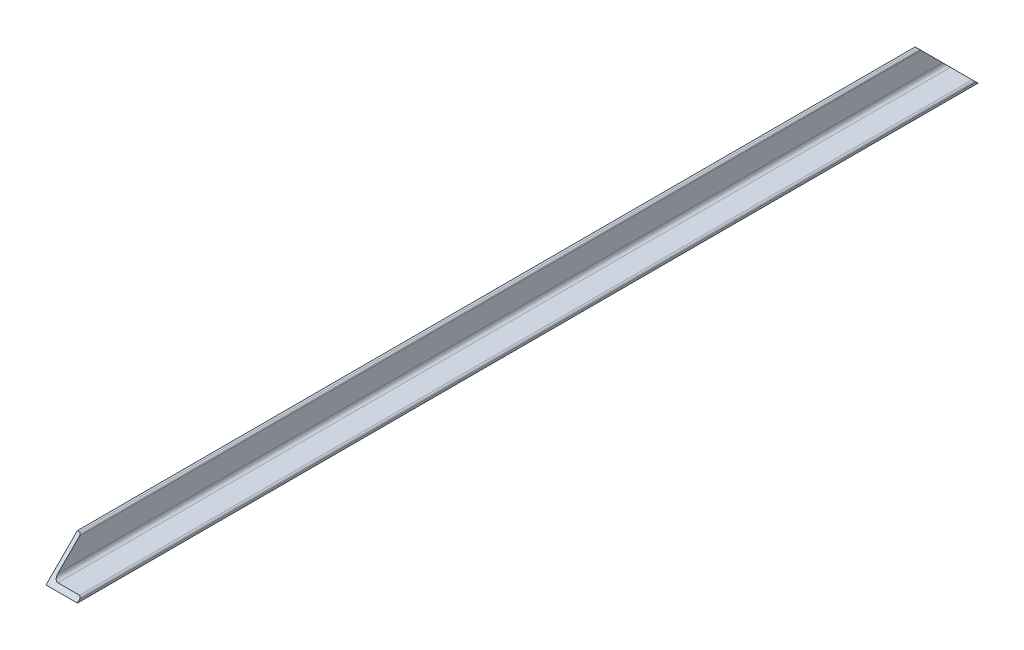
ISO-10303-21;
HEADER;
FILE_DESCRIPTION(('STEP AP214'),'2;1');
FILE_NAME('part.step','',(''),(''),'','','');
FILE_SCHEMA(('AUTOMOTIVE_DESIGN { 1 0 10303 214 1 1 1 1 }'));
ENDSEC;
DATA;
#1=APPLICATION_CONTEXT('core data for automotive mechanical design processes');
#2=APPLICATION_PROTOCOL_DEFINITION('international standard','automotive_design',2000,#1);
#3=PRODUCT_CONTEXT('',#1,'mechanical');
#4=PRODUCT('Part','Part','',(#3));
#5=PRODUCT_RELATED_PRODUCT_CATEGORY('part','',(#4));
#6=PRODUCT_DEFINITION_FORMATION('','',#4);
#7=PRODUCT_DEFINITION_CONTEXT('part definition',#1,'design');
#8=PRODUCT_DEFINITION('design','',#6,#7);
#9=PRODUCT_DEFINITION_SHAPE('','',#8);
#10=(LENGTH_UNIT() NAMED_UNIT(*) SI_UNIT(.MILLI.,.METRE.));
#11=(NAMED_UNIT(*) PLANE_ANGLE_UNIT() SI_UNIT($,.RADIAN.));
#12=(NAMED_UNIT(*) SI_UNIT($,.STERADIAN.) SOLID_ANGLE_UNIT());
#13=UNCERTAINTY_MEASURE_WITH_UNIT(LENGTH_MEASURE(1.E-05),#10,'distance_accuracy_value','');
#14=(GEOMETRIC_REPRESENTATION_CONTEXT(3) GLOBAL_UNCERTAINTY_ASSIGNED_CONTEXT((#13)) GLOBAL_UNIT_ASSIGNED_CONTEXT((#10,
#11,#12)) REPRESENTATION_CONTEXT('',''));
#15=CARTESIAN_POINT('',(0.,0.,0.));
#16=DIRECTION('',(0.,0.,1.));
#17=DIRECTION('',(1.,0.,0.));
#18=AXIS2_PLACEMENT_3D('',#15,#16,#17);
#19=CARTESIAN_POINT('',(0.,546.09999995,546.09999995));
#20=DIRECTION('',(0.,-0.707106781186548,-0.707106781186547));
#21=DIRECTION('',(0.,0.707106781186547,-0.707106781186548));
#22=AXIS2_PLACEMENT_3D('',#19,#20,#21);
#23=PLANE('',#22);
#24=DIRECTION('',(0.,-0.707106781186551,0.707106781186544));
#25=VECTOR('',#24,1.);
#26=CARTESIAN_POINT('',(38.1,2.47650000000001,1089.7234999));
#27=LINE('',#26,#25);
#28=CARTESIAN_POINT('',(38.1,2.47650000000003,1089.7234999));
#29=VERTEX_POINT('',#28);
#30=CARTESIAN_POINT('',(38.1,-1.2299533151221E-08,1092.19999996663));
#31=VERTEX_POINT('',#30);
#32=EDGE_CURVE('E35',#29,#31,#27,.T.);
#33=ORIENTED_EDGE('',*,*,#32,.F.);
#34=CARTESIAN_POINT('',(35.814,2.47650000000003,1089.7234999));
#35=DIRECTION('',(0.,-0.707106781186548,-0.707106781186547));
#36=DIRECTION('',(0.,-0.707106781186547,0.707106781186548));
#37=AXIS2_PLACEMENT_3D('',#34,#35,#36);
#38=ELLIPSE('',#37,3.23289220358491,2.286);
#39=CARTESIAN_POINT('',(35.814,4.7625,1087.4374999));
#40=VERTEX_POINT('',#39);
#41=EDGE_CURVE('E134',#40,#29,#38,.T.);
#42=ORIENTED_EDGE('',*,*,#41,.F.);
#43=DIRECTION('',(1.,0.,0.));
#44=VECTOR('',#43,1.);
#45=CARTESIAN_POINT('',(9.5885,4.76249999999992,1087.4374999));
#46=LINE('',#45,#44);
#47=CARTESIAN_POINT('',(9.5885,4.7625,1087.4374999));
#48=VERTEX_POINT('',#47);
#49=EDGE_CURVE('E126',#48,#40,#46,.T.);
#50=ORIENTED_EDGE('',*,*,#49,.F.);
#51=CARTESIAN_POINT('',(9.5885,9.5885,1082.6114999));
#52=DIRECTION('',(0.,0.707106781186548,0.707106781186548));
#53=DIRECTION('',(0.,-0.707106781186548,0.707106781186548));
#54=AXIS2_PLACEMENT_3D('',#51,#52,#53);
#55=ELLIPSE('',#54,6.82499465201256,4.826);
#56=CARTESIAN_POINT('',(4.7625,9.5885,1082.6114999));
#57=VERTEX_POINT('',#56);
#58=EDGE_CURVE('E129',#57,#48,#55,.T.);
#59=ORIENTED_EDGE('',*,*,#58,.F.);
#60=DIRECTION('',(0.,-0.70710678118655,0.707106781186545));
#61=VECTOR('',#60,1.);
#62=CARTESIAN_POINT('',(4.7625,35.8140000000001,1056.3859999));
#63=LINE('',#62,#61);
#64=CARTESIAN_POINT('',(4.7625,35.814,1056.3859999));
#65=VERTEX_POINT('',#64);
#66=EDGE_CURVE('E10',#65,#57,#63,.T.);
#67=ORIENTED_EDGE('',*,*,#66,.F.);
#68=CARTESIAN_POINT('',(2.4765,35.814,1056.3859999));
#69=DIRECTION('',(0.,-0.707106781186548,-0.707106781186547));
#70=DIRECTION('',(0.,-0.707106781186547,0.707106781186548));
#71=AXIS2_PLACEMENT_3D('',#68,#69,#70);
#72=ELLIPSE('',#71,3.23289220358491,2.286);
#73=CARTESIAN_POINT('',(2.4765,38.1,1054.0999999));
#74=VERTEX_POINT('',#73);
#75=EDGE_CURVE('E97',#74,#65,#72,.T.);
#76=ORIENTED_EDGE('',*,*,#75,.F.);
#77=DIRECTION('',(1.,0.,0.));
#78=VECTOR('',#77,1.);
#79=CARTESIAN_POINT('',(0.,38.1,1054.0999999));
#80=LINE('',#79,#78);
#81=CARTESIAN_POINT('',(0.,38.1,1054.0999999));
#82=VERTEX_POINT('',#81);
#83=EDGE_CURVE('E104',#82,#74,#80,.T.);
#84=ORIENTED_EDGE('',*,*,#83,.F.);
#85=DIRECTION('',(0.,0.707106781186547,-0.707106781186548));
#86=VECTOR('',#85,1.);
#87=CARTESIAN_POINT('',(0.,-4.99998558768833E-08,1092.19999995));
#88=LINE('',#87,#86);
#89=CARTESIAN_POINT('',(0.,-1.22995659131889E-08,1092.19999996663));
#90=VERTEX_POINT('',#89);
#91=EDGE_CURVE('E117',#90,#82,#88,.T.);
#92=ORIENTED_EDGE('',*,*,#91,.F.);
#93=DIRECTION('',(-1.,0.,0.));
#94=VECTOR('',#93,1.);
#95=CARTESIAN_POINT('',(38.1,0.,1092.2));
#96=LINE('',#95,#94);
#97=EDGE_CURVE('E114',#31,#90,#96,.T.);
#98=ORIENTED_EDGE('',*,*,#97,.F.);
#99=EDGE_LOOP('',(#33,#42,#50,#59,#67,#76,#84,#92,#98));
#100=FACE_BOUND('',#99,.T.);
#101=ADVANCED_FACE('F16',(#100),#23,.F.);
#102=CARTESIAN_POINT('',(4.7625,35.814,0.));
#103=DIRECTION('',(1.,0.,0.));
#104=DIRECTION('',(0.,0.,-1.));
#105=AXIS2_PLACEMENT_3D('',#102,#103,#104);
#106=PLANE('',#105);
#107=ORIENTED_EDGE('',*,*,#66,.T.);
#108=DIRECTION('',(0.,0.,1.));
#109=VECTOR('',#108,1.);
#110=CARTESIAN_POINT('',(4.7625,9.5885,9.58850010000008));
#111=LINE('',#110,#109);
#112=CARTESIAN_POINT('',(4.7625,9.5885,9.58850010000008));
#113=VERTEX_POINT('',#112);
#114=EDGE_CURVE('E122',#113,#57,#111,.T.);
#115=ORIENTED_EDGE('',*,*,#114,.F.);
#116=DIRECTION('',(0.,0.707106781186547,0.707106781186548));
#117=VECTOR('',#116,1.);
#118=CARTESIAN_POINT('',(4.7625,9.5885,9.58850010000008));
#119=LINE('',#118,#117);
#120=CARTESIAN_POINT('',(4.7625,35.814,35.8140001000001));
#121=VERTEX_POINT('',#120);
#122=EDGE_CURVE('E26',#113,#121,#119,.T.);
#123=ORIENTED_EDGE('',*,*,#122,.T.);
#124=DIRECTION('',(0.,0.,1.));
#125=VECTOR('',#124,1.);
#126=CARTESIAN_POINT('',(4.7625,35.814,35.8140001000001));
#127=LINE('',#126,#125);
#128=EDGE_CURVE('E93',#121,#65,#127,.T.);
#129=ORIENTED_EDGE('',*,*,#128,.T.);
#130=EDGE_LOOP('',(#107,#115,#123,#129));
#131=FACE_BOUND('',#130,.T.);
#132=ADVANCED_FACE('F189',(#131),#106,.T.);
#133=CARTESIAN_POINT('',(9.5885,9.5885,0.));
#134=DIRECTION('',(0.,0.,1.));
#135=DIRECTION('',(1.,0.,0.));
#136=AXIS2_PLACEMENT_3D('',#133,#134,#135);
#137=CYLINDRICAL_SURFACE('',#136,4.826);
#138=ORIENTED_EDGE('',*,*,#58,.T.);
#139=DIRECTION('',(0.,0.,1.));
#140=VECTOR('',#139,1.);
#141=CARTESIAN_POINT('',(9.5885,4.7625,4.76250010000008));
#142=LINE('',#141,#140);
#143=CARTESIAN_POINT('',(9.5885,4.7625,4.76250010000008));
#144=VERTEX_POINT('',#143);
#145=EDGE_CURVE('E130',#144,#48,#142,.T.);
#146=ORIENTED_EDGE('',*,*,#145,.F.);
#147=CARTESIAN_POINT('',(9.5885,9.5885,9.58850010000008));
#148=DIRECTION('',(0.,0.707106781186548,-0.707106781186547));
#149=DIRECTION('',(0.,-0.707106781186547,-0.707106781186548));
#150=AXIS2_PLACEMENT_3D('',#147,#148,#149);
#151=ELLIPSE('',#150,6.82499465201256,4.826);
#152=EDGE_CURVE('E125',#144,#113,#151,.T.);
#153=ORIENTED_EDGE('',*,*,#152,.T.);
#154=ORIENTED_EDGE('',*,*,#114,.T.);
#155=EDGE_LOOP('',(#138,#146,#153,#154));
#156=FACE_BOUND('',#155,.T.);
#157=ADVANCED_FACE('F166',(#156),#137,.F.);
#158=CARTESIAN_POINT('',(9.5885,4.7625,0.));
#159=DIRECTION('',(0.,1.,0.));
#160=DIRECTION('',(0.,0.,1.));
#161=AXIS2_PLACEMENT_3D('',#158,#159,#160);
#162=PLANE('',#161);
#163=ORIENTED_EDGE('',*,*,#49,.T.);
#164=DIRECTION('',(0.,0.,1.));
#165=VECTOR('',#164,1.);
#166=CARTESIAN_POINT('',(35.814,4.7625,4.76250010000008));
#167=LINE('',#166,#165);
#168=CARTESIAN_POINT('',(35.814,4.7625,4.76250010000008));
#169=VERTEX_POINT('',#168);
#170=EDGE_CURVE('E137',#169,#40,#167,.T.);
#171=ORIENTED_EDGE('',*,*,#170,.F.);
#172=DIRECTION('',(-1.,0.,0.));
#173=VECTOR('',#172,1.);
#174=CARTESIAN_POINT('',(35.814,4.7625,4.76250010000008));
#175=LINE('',#174,#173);
#176=EDGE_CURVE('E133',#169,#144,#175,.T.);
#177=ORIENTED_EDGE('',*,*,#176,.T.);
#178=ORIENTED_EDGE('',*,*,#145,.T.);
#179=EDGE_LOOP('',(#163,#171,#177,#178));
#180=FACE_BOUND('',#179,.T.);
#181=ADVANCED_FACE('F170',(#180),#162,.T.);
#182=CARTESIAN_POINT('',(35.814,2.47650000000003,0.));
#183=DIRECTION('',(0.,0.,1.));
#184=DIRECTION('',(1.,0.,0.));
#185=AXIS2_PLACEMENT_3D('',#182,#183,#184);
#186=CYLINDRICAL_SURFACE('',#185,2.286);
#187=ORIENTED_EDGE('',*,*,#41,.T.);
#188=DIRECTION('',(0.,0.,1.));
#189=VECTOR('',#188,1.);
#190=CARTESIAN_POINT('',(38.1,2.47650000000003,2.47650010000008));
#191=LINE('',#190,#189);
#192=CARTESIAN_POINT('',(38.1,2.47650000000003,2.47650010000008));
#193=VERTEX_POINT('',#192);
#194=EDGE_CURVE('E121',#193,#29,#191,.T.);
#195=ORIENTED_EDGE('',*,*,#194,.F.);
#196=CARTESIAN_POINT('',(35.814,2.47650000000003,2.47650010000008));
#197=DIRECTION('',(0.,-0.707106781186548,0.707106781186547));
#198=DIRECTION('',(0.,-0.707106781186547,-0.707106781186548));
#199=AXIS2_PLACEMENT_3D('',#196,#197,#198);
#200=ELLIPSE('',#199,3.23289220358491,2.286);
#201=EDGE_CURVE('E140',#193,#169,#200,.T.);
#202=ORIENTED_EDGE('',*,*,#201,.T.);
#203=ORIENTED_EDGE('',*,*,#170,.T.);
#204=EDGE_LOOP('',(#187,#195,#202,#203));
#205=FACE_BOUND('',#204,.T.);
#206=ADVANCED_FACE('F173',(#205),#186,.T.);
#207=CARTESIAN_POINT('',(0.,-5.0000027E-08,5.0000027E-08));
#208=DIRECTION('',(0.,-0.707106781186548,0.707106781186547));
#209=DIRECTION('',(0.,-0.707106781186547,-0.707106781186548));
#210=AXIS2_PLACEMENT_3D('',#207,#208,#209);
#211=PLANE('',#210);
#212=ORIENTED_EDGE('',*,*,#176,.F.);
#213=ORIENTED_EDGE('',*,*,#201,.F.);
#214=DIRECTION('',(0.,0.707106781186547,0.707106781186548));
#215=VECTOR('',#214,1.);
#216=CARTESIAN_POINT('',(38.1,-5.00000352591085E-08,5.00000441408915E-08));
#217=LINE('',#216,#215);
#218=CARTESIAN_POINT('',(38.1,-1.22995691838099E-08,3.33697973653099E-08));
#219=VERTEX_POINT('',#218);
#220=EDGE_CURVE('E145',#219,#193,#217,.T.);
#221=ORIENTED_EDGE('',*,*,#220,.F.);
#222=DIRECTION('',(-1.,0.,0.));
#223=VECTOR('',#222,1.);
#224=CARTESIAN_POINT('',(38.1,0.,0.));
#225=LINE('',#224,#223);
#226=CARTESIAN_POINT('',(0.,-1.22995791329573E-08,3.33697988513213E-08));
#227=VERTEX_POINT('',#226);
#228=EDGE_CURVE('E119',#219,#227,#225,.T.);
#229=ORIENTED_EDGE('',*,*,#228,.T.);
#230=DIRECTION('',(0.,-0.707106781186548,-0.707106781186548));
#231=VECTOR('',#230,1.);
#232=CARTESIAN_POINT('',(0.,38.1,38.1000001000001));
#233=LINE('',#232,#231);
#234=CARTESIAN_POINT('',(0.,38.1,38.1000001000001));
#235=VERTEX_POINT('',#234);
#236=EDGE_CURVE('E102',#235,#227,#233,.T.);
#237=ORIENTED_EDGE('',*,*,#236,.F.);
#238=DIRECTION('',(-1.,0.,0.));
#239=VECTOR('',#238,1.);
#240=CARTESIAN_POINT('',(2.4765,38.1,38.1000001000001));
#241=LINE('',#240,#239);
#242=CARTESIAN_POINT('',(2.4765,38.1,38.1000001000001));
#243=VERTEX_POINT('',#242);
#244=EDGE_CURVE('E85',#243,#235,#241,.T.);
#245=ORIENTED_EDGE('',*,*,#244,.F.);
#246=CARTESIAN_POINT('',(2.4765,35.814,35.8140001000001));
#247=DIRECTION('',(0.,-0.707106781186548,0.707106781186547));
#248=DIRECTION('',(0.,-0.707106781186547,-0.707106781186548));
#249=AXIS2_PLACEMENT_3D('',#246,#247,#248);
#250=ELLIPSE('',#249,3.23289220358491,2.286);
#251=EDGE_CURVE('E91',#121,#243,#250,.T.);
#252=ORIENTED_EDGE('',*,*,#251,.F.);
#253=ORIENTED_EDGE('',*,*,#122,.F.);
#254=ORIENTED_EDGE('',*,*,#152,.F.);
#255=EDGE_LOOP('',(#212,#213,#221,#229,#237,#245,#252,#253,#254));
#256=FACE_BOUND('',#255,.T.);
#257=ADVANCED_FACE('F100',(#256),#211,.F.);
#258=CARTESIAN_POINT('',(0.,0.,0.));
#259=DIRECTION('',(-1.,0.,0.));
#260=DIRECTION('',(0.,0.,1.));
#261=AXIS2_PLACEMENT_3D('',#258,#259,#260);
#262=PLANE('',#261);
#263=ORIENTED_EDGE('',*,*,#91,.T.);
#264=DIRECTION('',(0.,0.,1.));
#265=VECTOR('',#264,1.);
#266=CARTESIAN_POINT('',(0.,38.1,38.1000001000001));
#267=LINE('',#266,#265);
#268=EDGE_CURVE('E105',#235,#82,#267,.T.);
#269=ORIENTED_EDGE('',*,*,#268,.F.);
#270=ORIENTED_EDGE('',*,*,#236,.T.);
#271=DIRECTION('',(0.,0.,1.));
#272=VECTOR('',#271,1.);
#273=CARTESIAN_POINT('',(0.,0.,0.));
#274=LINE('',#273,#272);
#275=EDGE_CURVE('E151',#227,#90,#274,.T.);
#276=ORIENTED_EDGE('',*,*,#275,.T.);
#277=EDGE_LOOP('',(#263,#269,#270,#276));
#278=FACE_BOUND('',#277,.T.);
#279=ADVANCED_FACE('F178',(#278),#262,.T.);
#280=CARTESIAN_POINT('',(38.1,2.47650000000003,0.));
#281=DIRECTION('',(1.,0.,0.));
#282=DIRECTION('',(0.,0.,-1.));
#283=AXIS2_PLACEMENT_3D('',#280,#281,#282);
#284=PLANE('',#283);
#285=ORIENTED_EDGE('',*,*,#32,.T.);
#286=DIRECTION('',(0.,0.,1.));
#287=VECTOR('',#286,1.);
#288=CARTESIAN_POINT('',(38.1,0.,0.));
#289=LINE('',#288,#287);
#290=EDGE_CURVE('E111',#219,#31,#289,.T.);
#291=ORIENTED_EDGE('',*,*,#290,.F.);
#292=ORIENTED_EDGE('',*,*,#220,.T.);
#293=ORIENTED_EDGE('',*,*,#194,.T.);
#294=EDGE_LOOP('',(#285,#291,#292,#293));
#295=FACE_BOUND('',#294,.T.);
#296=ADVANCED_FACE('F174',(#295),#284,.T.);
#297=CARTESIAN_POINT('',(38.1,0.,0.));
#298=DIRECTION('',(0.,-1.,0.));
#299=DIRECTION('',(0.,0.,-1.));
#300=AXIS2_PLACEMENT_3D('',#297,#298,#299);
#301=PLANE('',#300);
#302=ORIENTED_EDGE('',*,*,#97,.T.);
#303=ORIENTED_EDGE('',*,*,#275,.F.);
#304=ORIENTED_EDGE('',*,*,#228,.F.);
#305=ORIENTED_EDGE('',*,*,#290,.T.);
#306=EDGE_LOOP('',(#302,#303,#304,#305));
#307=FACE_BOUND('',#306,.T.);
#308=ADVANCED_FACE('F177',(#307),#301,.T.);
#309=CARTESIAN_POINT('',(0.,38.1,0.));
#310=DIRECTION('',(0.,1.,0.));
#311=DIRECTION('',(0.,0.,1.));
#312=AXIS2_PLACEMENT_3D('',#309,#310,#311);
#313=PLANE('',#312);
#314=ORIENTED_EDGE('',*,*,#83,.T.);
#315=DIRECTION('',(0.,0.,1.));
#316=VECTOR('',#315,1.);
#317=CARTESIAN_POINT('',(2.4765,38.1,38.1000001000001));
#318=LINE('',#317,#316);
#319=EDGE_CURVE('E20',#243,#74,#318,.T.);
#320=ORIENTED_EDGE('',*,*,#319,.F.);
#321=ORIENTED_EDGE('',*,*,#244,.T.);
#322=ORIENTED_EDGE('',*,*,#268,.T.);
#323=EDGE_LOOP('',(#314,#320,#321,#322));
#324=FACE_BOUND('',#323,.T.);
#325=ADVANCED_FACE('F108',(#324),#313,.T.);
#326=CARTESIAN_POINT('',(2.4765,35.814,0.));
#327=DIRECTION('',(0.,0.,1.));
#328=DIRECTION('',(1.,0.,0.));
#329=AXIS2_PLACEMENT_3D('',#326,#327,#328);
#330=CYLINDRICAL_SURFACE('',#329,2.286);
#331=ORIENTED_EDGE('',*,*,#75,.T.);
#332=ORIENTED_EDGE('',*,*,#128,.F.);
#333=ORIENTED_EDGE('',*,*,#251,.T.);
#334=ORIENTED_EDGE('',*,*,#319,.T.);
#335=EDGE_LOOP('',(#331,#332,#333,#334));
#336=FACE_BOUND('',#335,.T.);
#337=ADVANCED_FACE('F18',(#336),#330,.T.);
#338=CLOSED_SHELL('',(#101,#132,#157,#181,#206,#257,#279,#296,#308,#325,#337));
#339=MANIFOLD_SOLID_BREP('B1',#338);
#340=ADVANCED_BREP_SHAPE_REPRESENTATION('',(#18,#339),#14);
#341=SHAPE_DEFINITION_REPRESENTATION(#9,#340);
ENDSEC;
END-ISO-10303-21;
